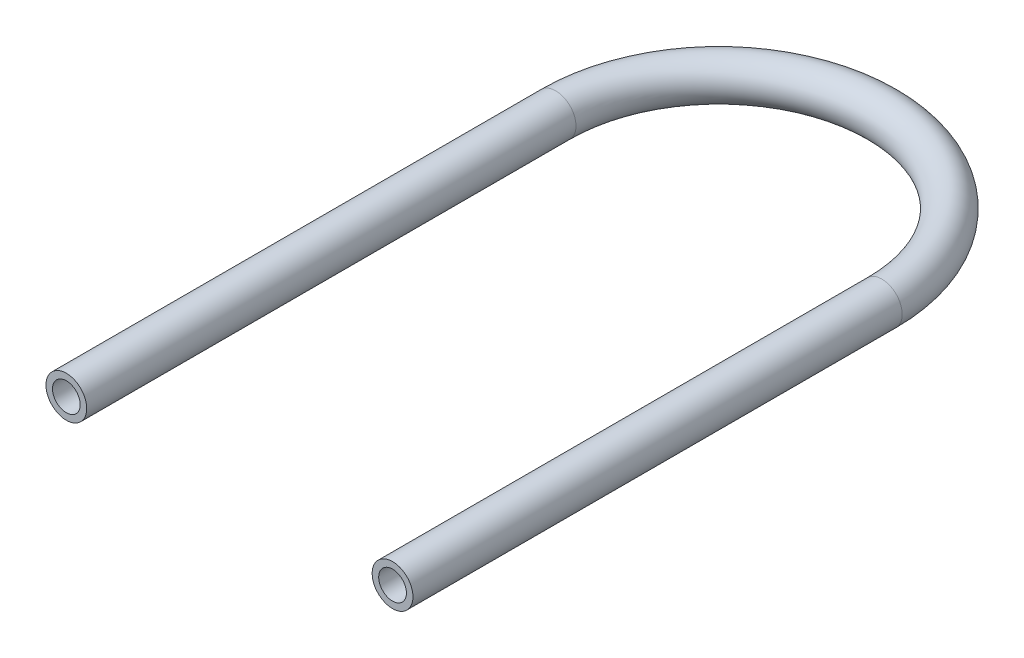
ISO-10303-21;
HEADER;
FILE_DESCRIPTION(('STEP AP214'),'2;1');
FILE_NAME('part.step','',(''),(''),'','','');
FILE_SCHEMA(('AUTOMOTIVE_DESIGN { 1 0 10303 214 1 1 1 1 }'));
ENDSEC;
DATA;
#1=APPLICATION_CONTEXT('core data for automotive mechanical design processes');
#2=APPLICATION_PROTOCOL_DEFINITION('international standard','automotive_design',2000,#1);
#3=PRODUCT_CONTEXT('',#1,'mechanical');
#4=PRODUCT('Part','Part','',(#3));
#5=PRODUCT_RELATED_PRODUCT_CATEGORY('part','',(#4));
#6=PRODUCT_DEFINITION_FORMATION('','',#4);
#7=PRODUCT_DEFINITION_CONTEXT('part definition',#1,'design');
#8=PRODUCT_DEFINITION('design','',#6,#7);
#9=PRODUCT_DEFINITION_SHAPE('','',#8);
#10=(LENGTH_UNIT() NAMED_UNIT(*) SI_UNIT(.MILLI.,.METRE.));
#11=(NAMED_UNIT(*) PLANE_ANGLE_UNIT() SI_UNIT($,.RADIAN.));
#12=(NAMED_UNIT(*) SI_UNIT($,.STERADIAN.) SOLID_ANGLE_UNIT());
#13=UNCERTAINTY_MEASURE_WITH_UNIT(LENGTH_MEASURE(1.E-05),#10,'distance_accuracy_value','');
#14=(GEOMETRIC_REPRESENTATION_CONTEXT(3) GLOBAL_UNCERTAINTY_ASSIGNED_CONTEXT((#13)) GLOBAL_UNIT_ASSIGNED_CONTEXT((#10,
#11,#12)) REPRESENTATION_CONTEXT('',''));
#15=CARTESIAN_POINT('',(0.,0.,0.));
#16=DIRECTION('',(0.,0.,1.));
#17=DIRECTION('',(1.,0.,0.));
#18=AXIS2_PLACEMENT_3D('',#15,#16,#17);
#19=CARTESIAN_POINT('',(25.4,0.,-76.1999999999997));
#20=DIRECTION('',(0.,0.,1.));
#21=DIRECTION('',(1.,0.,0.));
#22=AXIS2_PLACEMENT_3D('',#19,#20,#21);
#23=CYLINDRICAL_SURFACE('',#22,3.175);
#24=CARTESIAN_POINT('',(25.4,0.,-76.1999999999997));
#25=DIRECTION('',(0.,0.,-1.));
#26=DIRECTION('',(-1.,0.,0.));
#27=AXIS2_PLACEMENT_3D('',#24,#25,#26);
#28=CIRCLE('',#27,3.175);
#29=CARTESIAN_POINT('',(28.575,0.,-76.1999999999996));
#30=VERTEX_POINT('',#29);
#31=EDGE_CURVE('E40',#30,#30,#28,.T.);
#32=ORIENTED_EDGE('',*,*,#31,.F.);
#33=EDGE_LOOP('',(#32));
#34=FACE_BOUND('',#33,.T.);
#35=CARTESIAN_POINT('',(25.4,0.,3.60822483003176E-13));
#36=DIRECTION('',(0.,0.,-1.));
#37=DIRECTION('',(-1.,0.,0.));
#38=AXIS2_PLACEMENT_3D('',#35,#36,#37);
#39=CIRCLE('',#38,3.175);
#40=CARTESIAN_POINT('',(22.225,0.,3.14681861399865E-13));
#41=VERTEX_POINT('',#40);
#42=EDGE_CURVE('E10',#41,#41,#39,.T.);
#43=ORIENTED_EDGE('',*,*,#42,.T.);
#44=EDGE_LOOP('',(#43));
#45=FACE_BOUND('',#44,.T.);
#46=ADVANCED_FACE('F30',(#34,#45),#23,.T.);
#47=CARTESIAN_POINT('',(25.4,0.,-76.1999999999997));
#48=DIRECTION('',(0.,0.,1.));
#49=DIRECTION('',(1.,0.,0.));
#50=AXIS2_PLACEMENT_3D('',#47,#48,#49);
#51=CYLINDRICAL_SURFACE('',#50,2.159);
#52=CARTESIAN_POINT('',(25.4,0.,-76.1999999999997));
#53=DIRECTION('',(0.,0.,-1.));
#54=DIRECTION('',(-1.,0.,0.));
#55=AXIS2_PLACEMENT_3D('',#52,#53,#54);
#56=CIRCLE('',#55,2.159);
#57=CARTESIAN_POINT('',(27.559,0.,-76.1999999999996));
#58=VERTEX_POINT('',#57);
#59=EDGE_CURVE('E44',#58,#58,#56,.T.);
#60=ORIENTED_EDGE('',*,*,#59,.T.);
#61=EDGE_LOOP('',(#60));
#62=FACE_BOUND('',#61,.T.);
#63=CARTESIAN_POINT('',(25.4,0.,3.60822483003176E-13));
#64=DIRECTION('',(0.,0.,-1.));
#65=DIRECTION('',(-1.,0.,0.));
#66=AXIS2_PLACEMENT_3D('',#63,#64,#65);
#67=CIRCLE('',#66,2.159);
#68=CARTESIAN_POINT('',(23.241,0.,3.29446860312924E-13));
#69=VERTEX_POINT('',#68);
#70=EDGE_CURVE('E36',#69,#69,#67,.T.);
#71=ORIENTED_EDGE('',*,*,#70,.F.);
#72=EDGE_LOOP('',(#71));
#73=FACE_BOUND('',#72,.T.);
#74=ADVANCED_FACE('F87',(#62,#73),#51,.F.);
#75=CARTESIAN_POINT('',(0.,0.,-76.2));
#76=DIRECTION('',(0.,-1.,0.));
#77=DIRECTION('',(0.,0.,-1.));
#78=AXIS2_PLACEMENT_3D('',#75,#76,#77);
#79=TOROIDAL_SURFACE('',#78,25.4,3.175);
#80=CARTESIAN_POINT('',(-25.4,0.,-76.2));
#81=DIRECTION('',(0.,0.,1.));
#82=DIRECTION('',(1.,0.,0.));
#83=AXIS2_PLACEMENT_3D('',#80,#81,#82);
#84=CIRCLE('',#83,3.175);
#85=CARTESIAN_POINT('',(-28.575,0.,-76.2));
#86=VERTEX_POINT('',#85);
#87=EDGE_CURVE('E49',#86,#86,#84,.T.);
#88=CARTESIAN_POINT('',(0.,0.,-76.2));
#89=DIRECTION('',(0.,-1.,0.));
#90=DIRECTION('',(0.,0.,-1.));
#91=AXIS2_PLACEMENT_3D('',#88,#89,#90);
#92=CIRCLE('',#91,28.575);
#93=EDGE_CURVE('',#86,#30,#92,.T.);
#94=ORIENTED_EDGE('',*,*,#87,.F.);
#95=ORIENTED_EDGE('',*,*,#31,.T.);
#96=ORIENTED_EDGE('',*,*,#93,.T.);
#97=ORIENTED_EDGE('',*,*,#93,.F.);
#98=EDGE_LOOP('',(#94,#96,#95,#97));
#99=FACE_BOUND('',#98,.T.);
#100=ADVANCED_FACE('F92',(#99),#79,.T.);
#101=CARTESIAN_POINT('',(0.,0.,-76.2));
#102=DIRECTION('',(0.,-1.,0.));
#103=DIRECTION('',(0.,0.,-1.));
#104=AXIS2_PLACEMENT_3D('',#101,#102,#103);
#105=TOROIDAL_SURFACE('',#104,25.4,2.159);
#106=CARTESIAN_POINT('',(-25.4,0.,-76.2));
#107=DIRECTION('',(0.,0.,1.));
#108=DIRECTION('',(1.,0.,0.));
#109=AXIS2_PLACEMENT_3D('',#106,#107,#108);
#110=CIRCLE('',#109,2.159);
#111=CARTESIAN_POINT('',(-27.559,0.,-76.2));
#112=VERTEX_POINT('',#111);
#113=EDGE_CURVE('E53',#112,#112,#110,.T.);
#114=CARTESIAN_POINT('',(0.,0.,-76.2));
#115=DIRECTION('',(0.,-1.,0.));
#116=DIRECTION('',(0.,0.,-1.));
#117=AXIS2_PLACEMENT_3D('',#114,#115,#116);
#118=CIRCLE('',#117,27.559);
#119=EDGE_CURVE('',#112,#58,#118,.T.);
#120=ORIENTED_EDGE('',*,*,#113,.T.);
#121=ORIENTED_EDGE('',*,*,#59,.F.);
#122=ORIENTED_EDGE('',*,*,#119,.T.);
#123=ORIENTED_EDGE('',*,*,#119,.F.);
#124=EDGE_LOOP('',(#120,#122,#121,#123));
#125=FACE_BOUND('',#124,.T.);
#126=ADVANCED_FACE('F62',(#125),#105,.F.);
#127=CARTESIAN_POINT('',(-25.4,0.,-76.2));
#128=DIRECTION('',(0.,0.,1.));
#129=DIRECTION('',(1.,0.,0.));
#130=AXIS2_PLACEMENT_3D('',#127,#128,#129);
#131=CYLINDRICAL_SURFACE('',#130,2.159);
#132=ORIENTED_EDGE('',*,*,#113,.F.);
#133=EDGE_LOOP('',(#132));
#134=FACE_BOUND('',#133,.T.);
#135=CARTESIAN_POINT('',(-25.4,0.,0.));
#136=DIRECTION('',(0.,0.,1.));
#137=DIRECTION('',(1.,0.,0.));
#138=AXIS2_PLACEMENT_3D('',#135,#136,#137);
#139=CIRCLE('',#138,2.159);
#140=CARTESIAN_POINT('',(-23.241,0.,0.));
#141=VERTEX_POINT('',#140);
#142=EDGE_CURVE('E54',#141,#141,#139,.T.);
#143=ORIENTED_EDGE('',*,*,#142,.T.);
#144=EDGE_LOOP('',(#143));
#145=FACE_BOUND('',#144,.T.);
#146=ADVANCED_FACE('F65',(#134,#145),#131,.F.);
#147=CARTESIAN_POINT('',(-25.4,0.,-76.2));
#148=DIRECTION('',(0.,0.,1.));
#149=DIRECTION('',(1.,0.,0.));
#150=AXIS2_PLACEMENT_3D('',#147,#148,#149);
#151=CYLINDRICAL_SURFACE('',#150,3.175);
#152=ORIENTED_EDGE('',*,*,#87,.T.);
#153=EDGE_LOOP('',(#152));
#154=FACE_BOUND('',#153,.T.);
#155=CARTESIAN_POINT('',(-25.4,0.,0.));
#156=DIRECTION('',(0.,0.,1.));
#157=DIRECTION('',(1.,0.,0.));
#158=AXIS2_PLACEMENT_3D('',#155,#156,#157);
#159=CIRCLE('',#158,3.175);
#160=CARTESIAN_POINT('',(-22.225,0.,0.));
#161=VERTEX_POINT('',#160);
#162=EDGE_CURVE('E50',#161,#161,#159,.T.);
#163=ORIENTED_EDGE('',*,*,#162,.F.);
#164=EDGE_LOOP('',(#163));
#165=FACE_BOUND('',#164,.T.);
#166=ADVANCED_FACE('F68',(#154,#165),#151,.T.);
#167=CARTESIAN_POINT('',(25.4,0.,3.60822483003176E-13));
#168=DIRECTION('',(0.,0.,-1.));
#169=DIRECTION('',(-1.,0.,0.));
#170=AXIS2_PLACEMENT_3D('',#167,#168,#169);
#171=PLANE('',#170);
#172=ORIENTED_EDGE('',*,*,#70,.T.);
#173=EDGE_LOOP('',(#172));
#174=FACE_BOUND('',#173,.T.);
#175=ORIENTED_EDGE('',*,*,#42,.F.);
#176=EDGE_LOOP('',(#175));
#177=FACE_BOUND('',#176,.T.);
#178=ADVANCED_FACE('F75',(#174,#177),#171,.F.);
#179=CARTESIAN_POINT('',(-25.4,0.,0.));
#180=DIRECTION('',(0.,0.,1.));
#181=DIRECTION('',(1.,0.,0.));
#182=AXIS2_PLACEMENT_3D('',#179,#180,#181);
#183=PLANE('',#182);
#184=ORIENTED_EDGE('',*,*,#142,.F.);
#185=EDGE_LOOP('',(#184));
#186=FACE_BOUND('',#185,.T.);
#187=ORIENTED_EDGE('',*,*,#162,.T.);
#188=EDGE_LOOP('',(#187));
#189=FACE_BOUND('',#188,.T.);
#190=ADVANCED_FACE('F72',(#186,#189),#183,.T.);
#191=CLOSED_SHELL('',(#46,#74,#100,#126,#146,#166,#178,#190));
#192=MANIFOLD_SOLID_BREP('B2',#191);
#193=ADVANCED_BREP_SHAPE_REPRESENTATION('',(#18,#192),#14);
#194=SHAPE_DEFINITION_REPRESENTATION(#9,#193);
ENDSEC;
END-ISO-10303-21;
